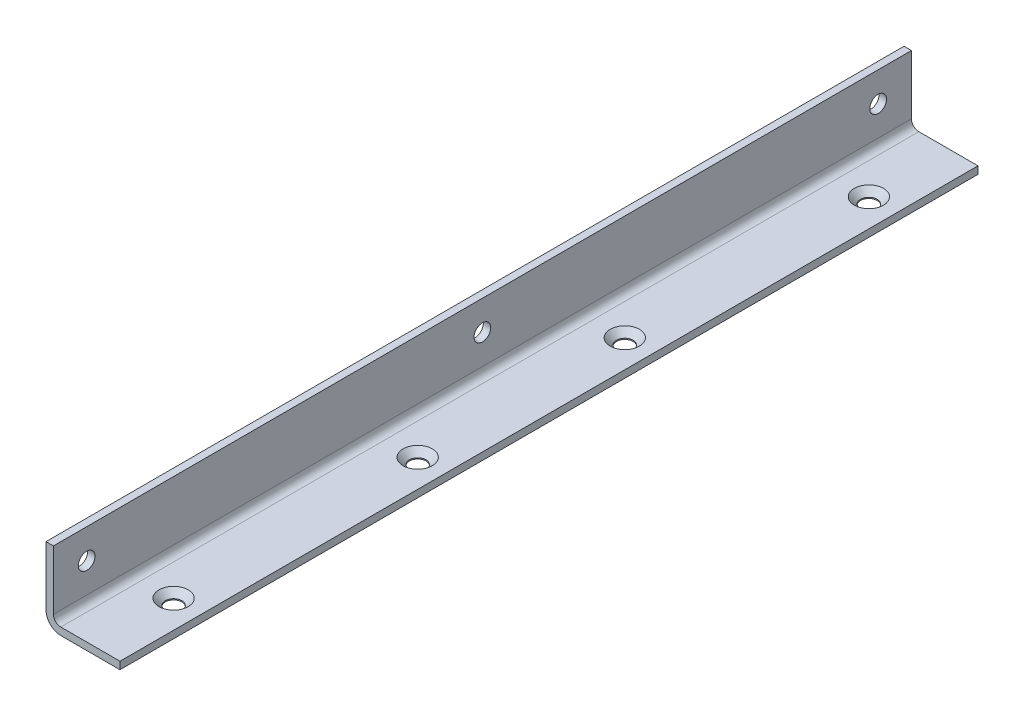
ISO-10303-21;
HEADER;
FILE_DESCRIPTION(('STEP AP214'),'2;1');
FILE_NAME('part.step','',(''),(''),'','','');
FILE_SCHEMA(('AUTOMOTIVE_DESIGN { 1 0 10303 214 1 1 1 1 }'));
ENDSEC;
DATA;
#1=APPLICATION_CONTEXT('core data for automotive mechanical design processes');
#2=APPLICATION_PROTOCOL_DEFINITION('international standard','automotive_design',2000,#1);
#3=PRODUCT_CONTEXT('',#1,'mechanical');
#4=PRODUCT('Part','Part','',(#3));
#5=PRODUCT_RELATED_PRODUCT_CATEGORY('part','',(#4));
#6=PRODUCT_DEFINITION_FORMATION('','',#4);
#7=PRODUCT_DEFINITION_CONTEXT('part definition',#1,'design');
#8=PRODUCT_DEFINITION('design','',#6,#7);
#9=PRODUCT_DEFINITION_SHAPE('','',#8);
#10=(LENGTH_UNIT() NAMED_UNIT(*) SI_UNIT(.MILLI.,.METRE.));
#11=(NAMED_UNIT(*) PLANE_ANGLE_UNIT() SI_UNIT($,.RADIAN.));
#12=(NAMED_UNIT(*) SI_UNIT($,.STERADIAN.) SOLID_ANGLE_UNIT());
#13=UNCERTAINTY_MEASURE_WITH_UNIT(LENGTH_MEASURE(1.E-05),#10,'distance_accuracy_value','');
#14=(GEOMETRIC_REPRESENTATION_CONTEXT(3) GLOBAL_UNCERTAINTY_ASSIGNED_CONTEXT((#13)) GLOBAL_UNIT_ASSIGNED_CONTEXT((#10,
#11,#12)) REPRESENTATION_CONTEXT('',''));
#15=CARTESIAN_POINT('',(0.,0.,0.));
#16=DIRECTION('',(0.,0.,1.));
#17=DIRECTION('',(1.,0.,0.));
#18=AXIS2_PLACEMENT_3D('',#15,#16,#17);
#19=CARTESIAN_POINT('',(0.,0.,232.));
#20=DIRECTION('',(1.,0.,0.));
#21=DIRECTION('',(0.,0.,-1.));
#22=AXIS2_PLACEMENT_3D('',#19,#20,#21);
#23=PLANE('',#22);
#24=CARTESIAN_POINT('',(0.,12.,116.));
#25=DIRECTION('',(1.,0.,0.));
#26=DIRECTION('',(0.,0.,-1.));
#27=AXIS2_PLACEMENT_3D('',#24,#25,#26);
#28=CIRCLE('',#27,2.25);
#29=CARTESIAN_POINT('',(0.,12.,113.75));
#30=VERTEX_POINT('',#29);
#31=EDGE_CURVE('E264',#30,#30,#28,.T.);
#32=ORIENTED_EDGE('',*,*,#31,.T.);
#33=EDGE_LOOP('',(#32));
#34=FACE_BOUND('',#33,.T.);
#35=CARTESIAN_POINT('',(0.,12.,9.00000000000007));
#36=DIRECTION('',(1.,0.,0.));
#37=DIRECTION('',(0.,0.,-1.));
#38=AXIS2_PLACEMENT_3D('',#35,#36,#37);
#39=CIRCLE('',#38,2.25);
#40=CARTESIAN_POINT('',(0.,12.,6.75000000000007));
#41=VERTEX_POINT('',#40);
#42=EDGE_CURVE('E269',#41,#41,#39,.T.);
#43=ORIENTED_EDGE('',*,*,#42,.T.);
#44=EDGE_LOOP('',(#43));
#45=FACE_BOUND('',#44,.T.);
#46=CARTESIAN_POINT('',(0.,12.,223.));
#47=DIRECTION('',(1.,0.,0.));
#48=DIRECTION('',(0.,0.,-1.));
#49=AXIS2_PLACEMENT_3D('',#46,#47,#48);
#50=CIRCLE('',#49,2.25000000000001);
#51=CARTESIAN_POINT('',(0.,12.,220.75));
#52=VERTEX_POINT('',#51);
#53=EDGE_CURVE('E135',#52,#52,#50,.T.);
#54=ORIENTED_EDGE('',*,*,#53,.T.);
#55=EDGE_LOOP('',(#54));
#56=FACE_BOUND('',#55,.T.);
#57=DIRECTION('',(0.,-1.,0.));
#58=VECTOR('',#57,1.);
#59=CARTESIAN_POINT('',(0.,0.,0.));
#60=LINE('',#59,#58);
#61=CARTESIAN_POINT('',(0.,20.,0.));
#62=VERTEX_POINT('',#61);
#63=CARTESIAN_POINT('',(0.,4.,0.));
#64=VERTEX_POINT('',#63);
#65=EDGE_CURVE('E133',#62,#64,#60,.T.);
#66=ORIENTED_EDGE('',*,*,#65,.T.);
#67=DIRECTION('',(0.,0.,-1.));
#68=VECTOR('',#67,1.);
#69=CARTESIAN_POINT('',(0.,4.,232.));
#70=LINE('',#69,#68);
#71=CARTESIAN_POINT('',(0.,4.,232.));
#72=VERTEX_POINT('',#71);
#73=EDGE_CURVE('E41',#64,#72,#70,.F.);
#74=ORIENTED_EDGE('',*,*,#73,.T.);
#75=DIRECTION('',(0.,-1.,0.));
#76=VECTOR('',#75,1.);
#77=CARTESIAN_POINT('',(0.,0.,232.));
#78=LINE('',#77,#76);
#79=CARTESIAN_POINT('',(0.,20.,232.));
#80=VERTEX_POINT('',#79);
#81=EDGE_CURVE('E107',#80,#72,#78,.T.);
#82=ORIENTED_EDGE('',*,*,#81,.F.);
#83=DIRECTION('',(0.,0.,-1.));
#84=VECTOR('',#83,1.);
#85=CARTESIAN_POINT('',(0.,20.,232.));
#86=LINE('',#85,#84);
#87=EDGE_CURVE('E132',#80,#62,#86,.T.);
#88=ORIENTED_EDGE('',*,*,#87,.T.);
#89=EDGE_LOOP('',(#66,#74,#82,#88));
#90=FACE_BOUND('',#89,.T.);
#91=ADVANCED_FACE('F33',(#34,#45,#56,#90),#23,.F.);
#92=CARTESIAN_POINT('',(0.,0.,232.));
#93=DIRECTION('',(0.,1.,0.));
#94=DIRECTION('',(0.,0.,1.));
#95=AXIS2_PLACEMENT_3D('',#92,#93,#94);
#96=PLANE('',#95);
#97=CARTESIAN_POINT('',(12.5,0.,88.));
#98=DIRECTION('',(0.,1.,0.));
#99=DIRECTION('',(0.,0.,1.));
#100=AXIS2_PLACEMENT_3D('',#97,#98,#99);
#101=CIRCLE('',#100,2.25);
#102=CARTESIAN_POINT('',(12.5,0.,90.25));
#103=VERTEX_POINT('',#102);
#104=EDGE_CURVE('E258',#103,#103,#101,.T.);
#105=ORIENTED_EDGE('',*,*,#104,.T.);
#106=EDGE_LOOP('',(#105));
#107=FACE_BOUND('',#106,.T.);
#108=CARTESIAN_POINT('',(12.5,0.,22.));
#109=DIRECTION('',(0.,1.,0.));
#110=DIRECTION('',(0.,0.,1.));
#111=AXIS2_PLACEMENT_3D('',#108,#109,#110);
#112=CIRCLE('',#111,2.25);
#113=CARTESIAN_POINT('',(12.5,0.,24.25));
#114=VERTEX_POINT('',#113);
#115=EDGE_CURVE('E252',#114,#114,#112,.T.);
#116=ORIENTED_EDGE('',*,*,#115,.T.);
#117=EDGE_LOOP('',(#116));
#118=FACE_BOUND('',#117,.T.);
#119=CARTESIAN_POINT('',(12.5,0.,144.));
#120=DIRECTION('',(0.,1.,0.));
#121=DIRECTION('',(0.,0.,1.));
#122=AXIS2_PLACEMENT_3D('',#119,#120,#121);
#123=CIRCLE('',#122,2.25);
#124=CARTESIAN_POINT('',(12.5,0.,146.25));
#125=VERTEX_POINT('',#124);
#126=EDGE_CURVE('E249',#125,#125,#123,.T.);
#127=ORIENTED_EDGE('',*,*,#126,.T.);
#128=EDGE_LOOP('',(#127));
#129=FACE_BOUND('',#128,.T.);
#130=CARTESIAN_POINT('',(12.5,0.,210.));
#131=DIRECTION('',(0.,1.,0.));
#132=DIRECTION('',(0.,0.,1.));
#133=AXIS2_PLACEMENT_3D('',#130,#131,#132);
#134=CIRCLE('',#133,2.25);
#135=CARTESIAN_POINT('',(12.5,0.,212.25));
#136=VERTEX_POINT('',#135);
#137=EDGE_CURVE('E251',#136,#136,#134,.T.);
#138=ORIENTED_EDGE('',*,*,#137,.T.);
#139=EDGE_LOOP('',(#138));
#140=FACE_BOUND('',#139,.T.);
#141=DIRECTION('',(1.,0.,0.));
#142=VECTOR('',#141,1.);
#143=CARTESIAN_POINT('',(0.,0.,232.));
#144=LINE('',#143,#142);
#145=CARTESIAN_POINT('',(4.,0.,232.));
#146=VERTEX_POINT('',#145);
#147=CARTESIAN_POINT('',(20.,0.,232.));
#148=VERTEX_POINT('',#147);
#149=EDGE_CURVE('E97',#146,#148,#144,.T.);
#150=ORIENTED_EDGE('',*,*,#149,.F.);
#151=DIRECTION('',(0.,0.,-1.));
#152=VECTOR('',#151,1.);
#153=CARTESIAN_POINT('',(4.,0.,232.));
#154=LINE('',#153,#152);
#155=CARTESIAN_POINT('',(4.,0.,0.));
#156=VERTEX_POINT('',#155);
#157=EDGE_CURVE('E182',#146,#156,#154,.T.);
#158=ORIENTED_EDGE('',*,*,#157,.T.);
#159=DIRECTION('',(1.,0.,0.));
#160=VECTOR('',#159,1.);
#161=CARTESIAN_POINT('',(0.,0.,0.));
#162=LINE('',#161,#160);
#163=CARTESIAN_POINT('',(20.,0.,0.));
#164=VERTEX_POINT('',#163);
#165=EDGE_CURVE('E112',#156,#164,#162,.T.);
#166=ORIENTED_EDGE('',*,*,#165,.T.);
#167=DIRECTION('',(0.,0.,-1.));
#168=VECTOR('',#167,1.);
#169=CARTESIAN_POINT('',(20.,0.,232.));
#170=LINE('',#169,#168);
#171=EDGE_CURVE('E110',#148,#164,#170,.T.);
#172=ORIENTED_EDGE('',*,*,#171,.F.);
#173=EDGE_LOOP('',(#150,#158,#166,#172));
#174=FACE_BOUND('',#173,.T.);
#175=ADVANCED_FACE('F111',(#107,#118,#129,#140,#174),#96,.F.);
#176=CARTESIAN_POINT('',(20.,0.,232.));
#177=DIRECTION('',(-1.,0.,0.));
#178=DIRECTION('',(0.,0.,1.));
#179=AXIS2_PLACEMENT_3D('',#176,#177,#178);
#180=PLANE('',#179);
#181=DIRECTION('',(0.,1.,0.));
#182=VECTOR('',#181,1.);
#183=CARTESIAN_POINT('',(20.,0.,0.));
#184=LINE('',#183,#182);
#185=CARTESIAN_POINT('',(20.,2.,0.));
#186=VERTEX_POINT('',#185);
#187=EDGE_CURVE('E137',#164,#186,#184,.T.);
#188=ORIENTED_EDGE('',*,*,#187,.T.);
#189=DIRECTION('',(0.,0.,-1.));
#190=VECTOR('',#189,1.);
#191=CARTESIAN_POINT('',(20.,2.,232.));
#192=LINE('',#191,#190);
#193=CARTESIAN_POINT('',(20.,2.,232.));
#194=VERTEX_POINT('',#193);
#195=EDGE_CURVE('E116',#194,#186,#192,.T.);
#196=ORIENTED_EDGE('',*,*,#195,.F.);
#197=DIRECTION('',(0.,1.,0.));
#198=VECTOR('',#197,1.);
#199=CARTESIAN_POINT('',(20.,0.,232.));
#200=LINE('',#199,#198);
#201=EDGE_CURVE('E101',#148,#194,#200,.T.);
#202=ORIENTED_EDGE('',*,*,#201,.F.);
#203=ORIENTED_EDGE('',*,*,#171,.T.);
#204=EDGE_LOOP('',(#188,#196,#202,#203));
#205=FACE_BOUND('',#204,.T.);
#206=ADVANCED_FACE('F118',(#205),#180,.F.);
#207=CARTESIAN_POINT('',(4.00000000000001,2.,232.));
#208=DIRECTION('',(0.,-1.,0.));
#209=DIRECTION('',(0.,0.,-1.));
#210=AXIS2_PLACEMENT_3D('',#207,#208,#209);
#211=PLANE('',#210);
#212=CARTESIAN_POINT('',(12.5,2.,22.));
#213=DIRECTION('',(0.,-1.,0.));
#214=DIRECTION('',(0.,0.,-1.));
#215=AXIS2_PLACEMENT_3D('',#212,#213,#214);
#216=CIRCLE('',#215,3.95000000000001);
#217=CARTESIAN_POINT('',(12.5,2.,18.05));
#218=VERTEX_POINT('',#217);
#219=EDGE_CURVE('E170',#218,#218,#216,.T.);
#220=ORIENTED_EDGE('',*,*,#219,.T.);
#221=EDGE_LOOP('',(#220));
#222=FACE_BOUND('',#221,.T.);
#223=CARTESIAN_POINT('',(12.5,2.,88.));
#224=DIRECTION('',(0.,-1.,0.));
#225=DIRECTION('',(0.,0.,-1.));
#226=AXIS2_PLACEMENT_3D('',#223,#224,#225);
#227=CIRCLE('',#226,3.95000000000001);
#228=CARTESIAN_POINT('',(12.5,2.,84.05));
#229=VERTEX_POINT('',#228);
#230=EDGE_CURVE('E167',#229,#229,#227,.T.);
#231=ORIENTED_EDGE('',*,*,#230,.T.);
#232=EDGE_LOOP('',(#231));
#233=FACE_BOUND('',#232,.T.);
#234=CARTESIAN_POINT('',(12.5,2.,144.));
#235=DIRECTION('',(0.,-1.,0.));
#236=DIRECTION('',(0.,0.,-1.));
#237=AXIS2_PLACEMENT_3D('',#234,#235,#236);
#238=CIRCLE('',#237,3.95000000000001);
#239=CARTESIAN_POINT('',(12.5,2.,140.05));
#240=VERTEX_POINT('',#239);
#241=EDGE_CURVE('E164',#240,#240,#238,.T.);
#242=ORIENTED_EDGE('',*,*,#241,.T.);
#243=EDGE_LOOP('',(#242));
#244=FACE_BOUND('',#243,.T.);
#245=CARTESIAN_POINT('',(12.5,2.,210.));
#246=DIRECTION('',(0.,-1.,0.));
#247=DIRECTION('',(0.,0.,-1.));
#248=AXIS2_PLACEMENT_3D('',#245,#246,#247);
#249=CIRCLE('',#248,3.95000000000001);
#250=CARTESIAN_POINT('',(12.5,2.,206.05));
#251=VERTEX_POINT('',#250);
#252=EDGE_CURVE('E161',#251,#251,#249,.T.);
#253=ORIENTED_EDGE('',*,*,#252,.T.);
#254=EDGE_LOOP('',(#253));
#255=FACE_BOUND('',#254,.T.);
#256=DIRECTION('',(-1.,0.,0.));
#257=VECTOR('',#256,1.);
#258=CARTESIAN_POINT('',(4.00000000000001,2.,0.));
#259=LINE('',#258,#257);
#260=CARTESIAN_POINT('',(4.00000000000001,2.,0.));
#261=VERTEX_POINT('',#260);
#262=EDGE_CURVE('E139',#186,#261,#259,.T.);
#263=ORIENTED_EDGE('',*,*,#262,.T.);
#264=DIRECTION('',(0.,0.,-1.));
#265=VECTOR('',#264,1.);
#266=CARTESIAN_POINT('',(4.00000000000001,2.,232.));
#267=LINE('',#266,#265);
#268=CARTESIAN_POINT('',(4.00000000000001,2.,232.));
#269=VERTEX_POINT('',#268);
#270=EDGE_CURVE('E155',#269,#261,#267,.T.);
#271=ORIENTED_EDGE('',*,*,#270,.F.);
#272=DIRECTION('',(-1.,0.,0.));
#273=VECTOR('',#272,1.);
#274=CARTESIAN_POINT('',(4.00000000000001,2.,232.));
#275=LINE('',#274,#273);
#276=EDGE_CURVE('E121',#194,#269,#275,.T.);
#277=ORIENTED_EDGE('',*,*,#276,.F.);
#278=ORIENTED_EDGE('',*,*,#195,.T.);
#279=EDGE_LOOP('',(#263,#271,#277,#278));
#280=FACE_BOUND('',#279,.T.);
#281=ADVANCED_FACE('F189',(#222,#233,#244,#255,#280),#211,.F.);
#282=CARTESIAN_POINT('',(4.,4.,232.));
#283=DIRECTION('',(0.,0.,-1.));
#284=DIRECTION('',(-1.,0.,0.));
#285=AXIS2_PLACEMENT_3D('',#282,#283,#284);
#286=CYLINDRICAL_SURFACE('',#285,2.);
#287=CARTESIAN_POINT('',(4.,4.,0.));
#288=DIRECTION('',(0.,0.,-1.));
#289=DIRECTION('',(-1.,0.,0.));
#290=AXIS2_PLACEMENT_3D('',#287,#288,#289);
#291=CIRCLE('',#290,2.);
#292=CARTESIAN_POINT('',(2.,4.00000000000001,0.));
#293=VERTEX_POINT('',#292);
#294=EDGE_CURVE('E141',#261,#293,#291,.T.);
#295=ORIENTED_EDGE('',*,*,#294,.T.);
#296=DIRECTION('',(0.,0.,-1.));
#297=VECTOR('',#296,1.);
#298=CARTESIAN_POINT('',(2.,4.00000000000001,232.));
#299=LINE('',#298,#297);
#300=CARTESIAN_POINT('',(2.,4.00000000000001,232.));
#301=VERTEX_POINT('',#300);
#302=EDGE_CURVE('E152',#301,#293,#299,.T.);
#303=ORIENTED_EDGE('',*,*,#302,.F.);
#304=CARTESIAN_POINT('',(4.,4.,232.));
#305=DIRECTION('',(0.,0.,-1.));
#306=DIRECTION('',(-1.,0.,0.));
#307=AXIS2_PLACEMENT_3D('',#304,#305,#306);
#308=CIRCLE('',#307,2.);
#309=EDGE_CURVE('E123',#269,#301,#308,.T.);
#310=ORIENTED_EDGE('',*,*,#309,.F.);
#311=ORIENTED_EDGE('',*,*,#270,.T.);
#312=EDGE_LOOP('',(#295,#303,#310,#311));
#313=FACE_BOUND('',#312,.T.);
#314=ADVANCED_FACE('F196',(#313),#286,.F.);
#315=CARTESIAN_POINT('',(2.,4.00000000000001,232.));
#316=DIRECTION('',(-1.,0.,0.));
#317=DIRECTION('',(0.,0.,1.));
#318=AXIS2_PLACEMENT_3D('',#315,#316,#317);
#319=PLANE('',#318);
#320=CARTESIAN_POINT('',(2.,12.,116.));
#321=DIRECTION('',(1.,0.,0.));
#322=DIRECTION('',(0.,0.,-1.));
#323=AXIS2_PLACEMENT_3D('',#320,#321,#322);
#324=CIRCLE('',#323,2.25);
#325=CARTESIAN_POINT('',(2.,12.,113.75));
#326=VERTEX_POINT('',#325);
#327=EDGE_CURVE('E255',#326,#326,#324,.T.);
#328=ORIENTED_EDGE('',*,*,#327,.F.);
#329=EDGE_LOOP('',(#328));
#330=FACE_BOUND('',#329,.T.);
#331=CARTESIAN_POINT('',(2.,12.,9.00000000000007));
#332=DIRECTION('',(1.,0.,0.));
#333=DIRECTION('',(0.,0.,1.));
#334=AXIS2_PLACEMENT_3D('',#331,#332,#333);
#335=CIRCLE('',#334,2.25);
#336=CARTESIAN_POINT('',(2.,12.,11.2500000000001));
#337=VERTEX_POINT('',#336);
#338=EDGE_CURVE('E266',#337,#337,#335,.T.);
#339=ORIENTED_EDGE('',*,*,#338,.F.);
#340=EDGE_LOOP('',(#339));
#341=FACE_BOUND('',#340,.T.);
#342=CARTESIAN_POINT('',(2.,12.,223.));
#343=DIRECTION('',(1.,0.,0.));
#344=DIRECTION('',(0.,0.,-1.));
#345=AXIS2_PLACEMENT_3D('',#342,#343,#344);
#346=CIRCLE('',#345,2.25000000000001);
#347=CARTESIAN_POINT('',(2.,12.,220.75));
#348=VERTEX_POINT('',#347);
#349=EDGE_CURVE('E272',#348,#348,#346,.T.);
#350=ORIENTED_EDGE('',*,*,#349,.F.);
#351=EDGE_LOOP('',(#350));
#352=FACE_BOUND('',#351,.T.);
#353=DIRECTION('',(0.,1.,0.));
#354=VECTOR('',#353,1.);
#355=CARTESIAN_POINT('',(2.,4.00000000000001,0.));
#356=LINE('',#355,#354);
#357=CARTESIAN_POINT('',(2.,20.,0.));
#358=VERTEX_POINT('',#357);
#359=EDGE_CURVE('E143',#293,#358,#356,.T.);
#360=ORIENTED_EDGE('',*,*,#359,.T.);
#361=DIRECTION('',(0.,0.,-1.));
#362=VECTOR('',#361,1.);
#363=CARTESIAN_POINT('',(2.,20.,232.));
#364=LINE('',#363,#362);
#365=CARTESIAN_POINT('',(2.,20.,232.));
#366=VERTEX_POINT('',#365);
#367=EDGE_CURVE('E149',#366,#358,#364,.T.);
#368=ORIENTED_EDGE('',*,*,#367,.F.);
#369=DIRECTION('',(0.,1.,0.));
#370=VECTOR('',#369,1.);
#371=CARTESIAN_POINT('',(2.,4.00000000000001,232.));
#372=LINE('',#371,#370);
#373=EDGE_CURVE('E128',#301,#366,#372,.T.);
#374=ORIENTED_EDGE('',*,*,#373,.F.);
#375=ORIENTED_EDGE('',*,*,#302,.T.);
#376=EDGE_LOOP('',(#360,#368,#374,#375));
#377=FACE_BOUND('',#376,.T.);
#378=ADVANCED_FACE('F199',(#330,#341,#352,#377),#319,.F.);
#379=CARTESIAN_POINT('',(0.,20.,232.));
#380=DIRECTION('',(0.,-1.,0.));
#381=DIRECTION('',(0.,0.,-1.));
#382=AXIS2_PLACEMENT_3D('',#379,#380,#381);
#383=PLANE('',#382);
#384=DIRECTION('',(-1.,0.,0.));
#385=VECTOR('',#384,1.);
#386=CARTESIAN_POINT('',(0.,20.,0.));
#387=LINE('',#386,#385);
#388=EDGE_CURVE('E145',#358,#62,#387,.T.);
#389=ORIENTED_EDGE('',*,*,#388,.T.);
#390=ORIENTED_EDGE('',*,*,#87,.F.);
#391=DIRECTION('',(-1.,0.,0.));
#392=VECTOR('',#391,1.);
#393=CARTESIAN_POINT('',(0.,20.,232.));
#394=LINE('',#393,#392);
#395=EDGE_CURVE('E130',#366,#80,#394,.T.);
#396=ORIENTED_EDGE('',*,*,#395,.F.);
#397=ORIENTED_EDGE('',*,*,#367,.T.);
#398=EDGE_LOOP('',(#389,#390,#396,#397));
#399=FACE_BOUND('',#398,.T.);
#400=ADVANCED_FACE('F204',(#399),#383,.F.);
#401=CARTESIAN_POINT('',(4.,4.,232.));
#402=DIRECTION('',(0.,0.,-1.));
#403=DIRECTION('',(-1.,0.,0.));
#404=AXIS2_PLACEMENT_3D('',#401,#402,#403);
#405=PLANE('',#404);
#406=ORIENTED_EDGE('',*,*,#81,.T.);
#407=CARTESIAN_POINT('',(4.,4.,232.));
#408=DIRECTION('',(0.,0.,-1.));
#409=DIRECTION('',(-1.,0.,0.));
#410=AXIS2_PLACEMENT_3D('',#407,#408,#409);
#411=CIRCLE('',#410,4.);
#412=EDGE_CURVE('E11',#72,#146,#411,.F.);
#413=ORIENTED_EDGE('',*,*,#412,.T.);
#414=ORIENTED_EDGE('',*,*,#149,.T.);
#415=ORIENTED_EDGE('',*,*,#201,.T.);
#416=ORIENTED_EDGE('',*,*,#276,.T.);
#417=ORIENTED_EDGE('',*,*,#309,.T.);
#418=ORIENTED_EDGE('',*,*,#373,.T.);
#419=ORIENTED_EDGE('',*,*,#395,.T.);
#420=EDGE_LOOP('',(#406,#413,#414,#415,#416,#417,#418,#419));
#421=FACE_BOUND('',#420,.T.);
#422=ADVANCED_FACE('F99',(#421),#405,.F.);
#423=CARTESIAN_POINT('',(4.,4.,0.));
#424=DIRECTION('',(0.,0.,-1.));
#425=DIRECTION('',(-1.,0.,0.));
#426=AXIS2_PLACEMENT_3D('',#423,#424,#425);
#427=PLANE('',#426);
#428=ORIENTED_EDGE('',*,*,#165,.F.);
#429=CARTESIAN_POINT('',(4.,4.,0.));
#430=DIRECTION('',(0.,0.,-1.));
#431=DIRECTION('',(-1.,0.,0.));
#432=AXIS2_PLACEMENT_3D('',#429,#430,#431);
#433=CIRCLE('',#432,4.);
#434=EDGE_CURVE('E55',#156,#64,#433,.T.);
#435=ORIENTED_EDGE('',*,*,#434,.T.);
#436=ORIENTED_EDGE('',*,*,#65,.F.);
#437=ORIENTED_EDGE('',*,*,#388,.F.);
#438=ORIENTED_EDGE('',*,*,#359,.F.);
#439=ORIENTED_EDGE('',*,*,#294,.F.);
#440=ORIENTED_EDGE('',*,*,#262,.F.);
#441=ORIENTED_EDGE('',*,*,#187,.F.);
#442=EDGE_LOOP('',(#428,#435,#436,#437,#438,#439,#440,#441));
#443=FACE_BOUND('',#442,.T.);
#444=ADVANCED_FACE('F185',(#443),#427,.T.);
#445=CARTESIAN_POINT('',(-8.,12.,223.));
#446=DIRECTION('',(1.,0.,0.));
#447=DIRECTION('',(0.,0.,-1.));
#448=AXIS2_PLACEMENT_3D('',#445,#446,#447);
#449=CYLINDRICAL_SURFACE('',#448,2.25000000000001);
#450=ORIENTED_EDGE('',*,*,#349,.T.);
#451=EDGE_LOOP('',(#450));
#452=FACE_BOUND('',#451,.T.);
#453=ORIENTED_EDGE('',*,*,#53,.F.);
#454=EDGE_LOOP('',(#453));
#455=FACE_BOUND('',#454,.T.);
#456=ADVANCED_FACE('F279',(#452,#455),#449,.F.);
#457=CARTESIAN_POINT('',(-8.,12.,9.00000000000007));
#458=DIRECTION('',(1.,0.,0.));
#459=DIRECTION('',(0.,0.,-1.));
#460=AXIS2_PLACEMENT_3D('',#457,#458,#459);
#461=CYLINDRICAL_SURFACE('',#460,2.25);
#462=ORIENTED_EDGE('',*,*,#338,.T.);
#463=EDGE_LOOP('',(#462));
#464=FACE_BOUND('',#463,.T.);
#465=ORIENTED_EDGE('',*,*,#42,.F.);
#466=EDGE_LOOP('',(#465));
#467=FACE_BOUND('',#466,.T.);
#468=ADVANCED_FACE('F281',(#464,#467),#461,.F.);
#469=CARTESIAN_POINT('',(-8.,12.,116.));
#470=DIRECTION('',(1.,0.,0.));
#471=DIRECTION('',(0.,0.,-1.));
#472=AXIS2_PLACEMENT_3D('',#469,#470,#471);
#473=CYLINDRICAL_SURFACE('',#472,2.25);
#474=ORIENTED_EDGE('',*,*,#327,.T.);
#475=EDGE_LOOP('',(#474));
#476=FACE_BOUND('',#475,.T.);
#477=ORIENTED_EDGE('',*,*,#31,.F.);
#478=EDGE_LOOP('',(#477));
#479=FACE_BOUND('',#478,.T.);
#480=ADVANCED_FACE('F288',(#476,#479),#473,.F.);
#481=CARTESIAN_POINT('',(12.5,-8.,210.));
#482=DIRECTION('',(0.,1.,0.));
#483=DIRECTION('',(0.,0.,1.));
#484=AXIS2_PLACEMENT_3D('',#481,#482,#483);
#485=CYLINDRICAL_SURFACE('',#484,2.25);
#486=CARTESIAN_POINT('',(12.5,0.300000000000016,210.));
#487=DIRECTION('',(0.,-1.,0.));
#488=DIRECTION('',(0.,0.,-1.));
#489=AXIS2_PLACEMENT_3D('',#486,#487,#488);
#490=CIRCLE('',#489,2.25);
#491=CARTESIAN_POINT('',(12.5,0.300000000000016,207.75));
#492=VERTEX_POINT('',#491);
#493=EDGE_CURVE('E179',#492,#492,#490,.F.);
#494=ORIENTED_EDGE('',*,*,#493,.T.);
#495=EDGE_LOOP('',(#494));
#496=FACE_BOUND('',#495,.T.);
#497=ORIENTED_EDGE('',*,*,#137,.F.);
#498=EDGE_LOOP('',(#497));
#499=FACE_BOUND('',#498,.T.);
#500=ADVANCED_FACE('F245',(#496,#499),#485,.F.);
#501=CARTESIAN_POINT('',(12.5,-8.,144.));
#502=DIRECTION('',(0.,1.,0.));
#503=DIRECTION('',(0.,0.,1.));
#504=AXIS2_PLACEMENT_3D('',#501,#502,#503);
#505=CYLINDRICAL_SURFACE('',#504,2.25);
#506=CARTESIAN_POINT('',(12.5,0.300000000000016,144.));
#507=DIRECTION('',(0.,-1.,0.));
#508=DIRECTION('',(0.,0.,-1.));
#509=AXIS2_PLACEMENT_3D('',#506,#507,#508);
#510=CIRCLE('',#509,2.25);
#511=CARTESIAN_POINT('',(12.5,0.300000000000016,141.75));
#512=VERTEX_POINT('',#511);
#513=EDGE_CURVE('E176',#512,#512,#510,.F.);
#514=ORIENTED_EDGE('',*,*,#513,.T.);
#515=EDGE_LOOP('',(#514));
#516=FACE_BOUND('',#515,.T.);
#517=ORIENTED_EDGE('',*,*,#126,.F.);
#518=EDGE_LOOP('',(#517));
#519=FACE_BOUND('',#518,.T.);
#520=ADVANCED_FACE('F241',(#516,#519),#505,.F.);
#521=CARTESIAN_POINT('',(12.5,-8.,22.));
#522=DIRECTION('',(0.,1.,0.));
#523=DIRECTION('',(0.,0.,1.));
#524=AXIS2_PLACEMENT_3D('',#521,#522,#523);
#525=CYLINDRICAL_SURFACE('',#524,2.25);
#526=CARTESIAN_POINT('',(12.5,0.300000000000016,22.));
#527=DIRECTION('',(0.,-1.,0.));
#528=DIRECTION('',(0.,0.,-1.));
#529=AXIS2_PLACEMENT_3D('',#526,#527,#528);
#530=CIRCLE('',#529,2.25);
#531=CARTESIAN_POINT('',(12.5,0.300000000000016,19.75));
#532=VERTEX_POINT('',#531);
#533=EDGE_CURVE('E115',#532,#532,#530,.F.);
#534=ORIENTED_EDGE('',*,*,#533,.T.);
#535=EDGE_LOOP('',(#534));
#536=FACE_BOUND('',#535,.T.);
#537=ORIENTED_EDGE('',*,*,#115,.F.);
#538=EDGE_LOOP('',(#537));
#539=FACE_BOUND('',#538,.T.);
#540=ADVANCED_FACE('F244',(#536,#539),#525,.F.);
#541=CARTESIAN_POINT('',(12.5,-8.,88.));
#542=DIRECTION('',(0.,1.,0.));
#543=DIRECTION('',(0.,0.,1.));
#544=AXIS2_PLACEMENT_3D('',#541,#542,#543);
#545=CYLINDRICAL_SURFACE('',#544,2.25);
#546=CARTESIAN_POINT('',(12.5,0.300000000000016,88.));
#547=DIRECTION('',(0.,-1.,0.));
#548=DIRECTION('',(0.,0.,-1.));
#549=AXIS2_PLACEMENT_3D('',#546,#547,#548);
#550=CIRCLE('',#549,2.25);
#551=CARTESIAN_POINT('',(12.5,0.300000000000016,85.75));
#552=VERTEX_POINT('',#551);
#553=EDGE_CURVE('E173',#552,#552,#550,.F.);
#554=ORIENTED_EDGE('',*,*,#553,.T.);
#555=EDGE_LOOP('',(#554));
#556=FACE_BOUND('',#555,.T.);
#557=ORIENTED_EDGE('',*,*,#104,.F.);
#558=EDGE_LOOP('',(#557));
#559=FACE_BOUND('',#558,.T.);
#560=ADVANCED_FACE('F228',(#556,#559),#545,.F.);
#561=CARTESIAN_POINT('',(12.5,0.300000000000016,22.));
#562=DIRECTION('',(0.,1.,0.));
#563=DIRECTION('',(0.,0.,1.));
#564=AXIS2_PLACEMENT_3D('',#561,#562,#563);
#565=CONICAL_SURFACE('',#564,2.25,0.785398163397454);
#566=ORIENTED_EDGE('',*,*,#219,.F.);
#567=EDGE_LOOP('',(#566));
#568=FACE_BOUND('',#567,.T.);
#569=ORIENTED_EDGE('',*,*,#533,.F.);
#570=EDGE_LOOP('',(#569));
#571=FACE_BOUND('',#570,.T.);
#572=ADVANCED_FACE('F224',(#568,#571),#565,.F.);
#573=CARTESIAN_POINT('',(12.5,0.300000000000016,88.));
#574=DIRECTION('',(0.,1.,0.));
#575=DIRECTION('',(0.,0.,1.));
#576=AXIS2_PLACEMENT_3D('',#573,#574,#575);
#577=CONICAL_SURFACE('',#576,2.25,0.785398163397454);
#578=ORIENTED_EDGE('',*,*,#230,.F.);
#579=EDGE_LOOP('',(#578));
#580=FACE_BOUND('',#579,.T.);
#581=ORIENTED_EDGE('',*,*,#553,.F.);
#582=EDGE_LOOP('',(#581));
#583=FACE_BOUND('',#582,.T.);
#584=ADVANCED_FACE('F227',(#580,#583),#577,.F.);
#585=CARTESIAN_POINT('',(12.5,0.300000000000016,144.));
#586=DIRECTION('',(0.,1.,0.));
#587=DIRECTION('',(0.,0.,1.));
#588=AXIS2_PLACEMENT_3D('',#585,#586,#587);
#589=CONICAL_SURFACE('',#588,2.25,0.785398163397454);
#590=ORIENTED_EDGE('',*,*,#241,.F.);
#591=EDGE_LOOP('',(#590));
#592=FACE_BOUND('',#591,.T.);
#593=ORIENTED_EDGE('',*,*,#513,.F.);
#594=EDGE_LOOP('',(#593));
#595=FACE_BOUND('',#594,.T.);
#596=ADVANCED_FACE('F210',(#592,#595),#589,.F.);
#597=CARTESIAN_POINT('',(12.5,0.300000000000016,210.));
#598=DIRECTION('',(0.,1.,0.));
#599=DIRECTION('',(0.,0.,1.));
#600=AXIS2_PLACEMENT_3D('',#597,#598,#599);
#601=CONICAL_SURFACE('',#600,2.25,0.785398163397454);
#602=ORIENTED_EDGE('',*,*,#252,.F.);
#603=EDGE_LOOP('',(#602));
#604=FACE_BOUND('',#603,.T.);
#605=ORIENTED_EDGE('',*,*,#493,.F.);
#606=EDGE_LOOP('',(#605));
#607=FACE_BOUND('',#606,.T.);
#608=ADVANCED_FACE('F206',(#604,#607),#601,.F.);
#609=CARTESIAN_POINT('',(4.,4.,232.));
#610=DIRECTION('',(0.,0.,-1.));
#611=DIRECTION('',(-1.,0.,0.));
#612=AXIS2_PLACEMENT_3D('',#609,#610,#611);
#613=CYLINDRICAL_SURFACE('',#612,4.);
#614=ORIENTED_EDGE('',*,*,#412,.F.);
#615=ORIENTED_EDGE('',*,*,#73,.F.);
#616=ORIENTED_EDGE('',*,*,#434,.F.);
#617=ORIENTED_EDGE('',*,*,#157,.F.);
#618=EDGE_LOOP('',(#614,#615,#616,#617));
#619=FACE_BOUND('',#618,.T.);
#620=ADVANCED_FACE('F35',(#619),#613,.T.);
#621=CLOSED_SHELL('',(#91,#175,#206,#281,#314,#378,#400,#422,#444,#456,#468,#480,#500,#520,#540,
#560,#572,#584,#596,#608,#620));
#622=MANIFOLD_SOLID_BREP('B2',#621);
#623=ADVANCED_BREP_SHAPE_REPRESENTATION('',(#18,#622),#14);
#624=SHAPE_DEFINITION_REPRESENTATION(#9,#623);
ENDSEC;
END-ISO-10303-21;
